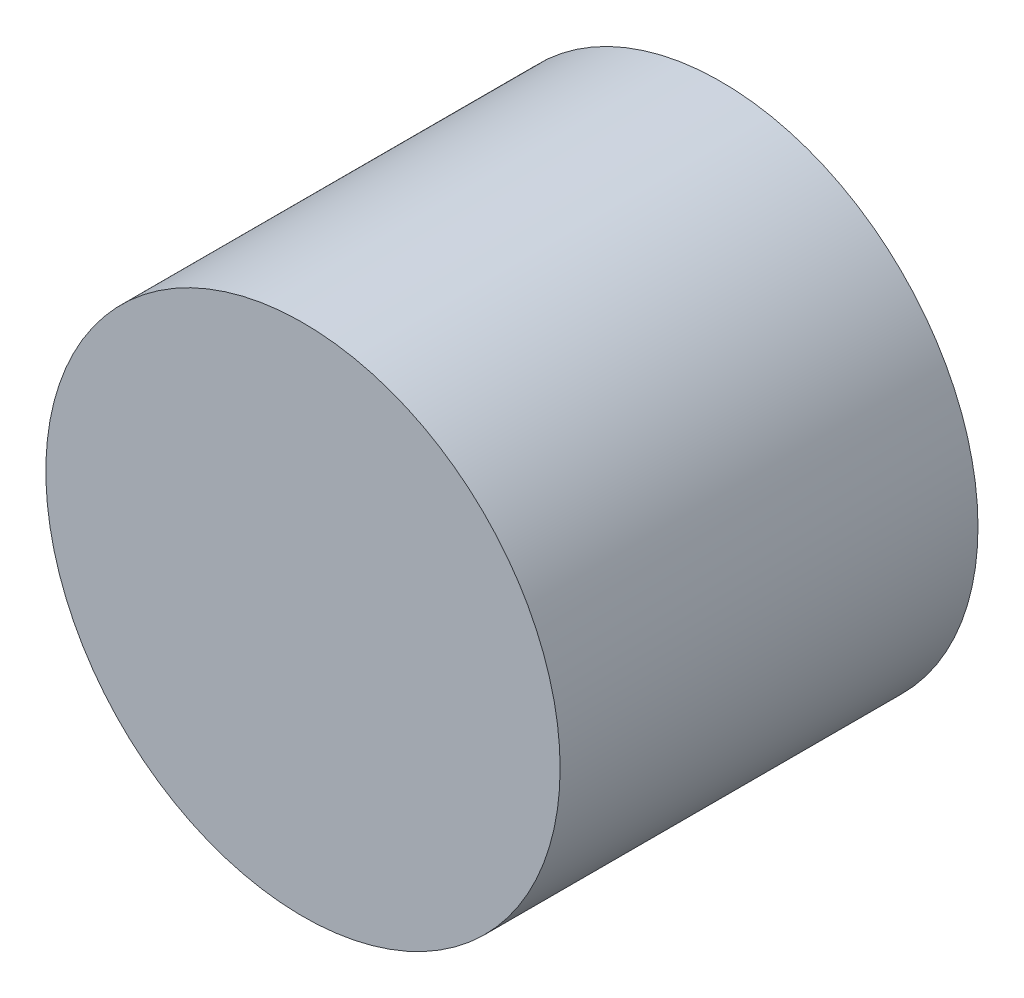
ISO-10303-21;
HEADER;
FILE_DESCRIPTION(('STEP AP214'),'2;1');
FILE_NAME('part.step','',(''),(''),'','','');
FILE_SCHEMA(('AUTOMOTIVE_DESIGN { 1 0 10303 214 1 1 1 1 }'));
ENDSEC;
DATA;
#1=APPLICATION_CONTEXT('core data for automotive mechanical design processes');
#2=APPLICATION_PROTOCOL_DEFINITION('international standard','automotive_design',2000,#1);
#3=PRODUCT_CONTEXT('',#1,'mechanical');
#4=PRODUCT('Part','Part','',(#3));
#5=PRODUCT_RELATED_PRODUCT_CATEGORY('part','',(#4));
#6=PRODUCT_DEFINITION_FORMATION('','',#4);
#7=PRODUCT_DEFINITION_CONTEXT('part definition',#1,'design');
#8=PRODUCT_DEFINITION('design','',#6,#7);
#9=PRODUCT_DEFINITION_SHAPE('','',#8);
#10=(LENGTH_UNIT() NAMED_UNIT(*) SI_UNIT(.MILLI.,.METRE.));
#11=(NAMED_UNIT(*) PLANE_ANGLE_UNIT() SI_UNIT($,.RADIAN.));
#12=(NAMED_UNIT(*) SI_UNIT($,.STERADIAN.) SOLID_ANGLE_UNIT());
#13=UNCERTAINTY_MEASURE_WITH_UNIT(LENGTH_MEASURE(1.E-05),#10,'distance_accuracy_value','');
#14=(GEOMETRIC_REPRESENTATION_CONTEXT(3) GLOBAL_UNCERTAINTY_ASSIGNED_CONTEXT((#13)) GLOBAL_UNIT_ASSIGNED_CONTEXT((#10,
#11,#12)) REPRESENTATION_CONTEXT('',''));
#15=CARTESIAN_POINT('',(0.,0.,0.));
#16=DIRECTION('',(0.,0.,1.));
#17=DIRECTION('',(1.,0.,0.));
#18=AXIS2_PLACEMENT_3D('',#15,#16,#17);
#19=CARTESIAN_POINT('',(0.,0.,16.51));
#20=DIRECTION('',(0.,0.,-1.));
#21=DIRECTION('',(-1.,0.,0.));
#22=AXIS2_PLACEMENT_3D('',#19,#20,#21);
#23=CYLINDRICAL_SURFACE('',#22,10.16);
#24=CARTESIAN_POINT('',(0.,0.,16.51));
#25=DIRECTION('',(0.,0.,1.));
#26=DIRECTION('',(1.,0.,0.));
#27=AXIS2_PLACEMENT_3D('',#24,#25,#26);
#28=CIRCLE('',#27,10.16);
#29=CARTESIAN_POINT('',(10.16,0.,16.51));
#30=VERTEX_POINT('',#29);
#31=EDGE_CURVE('E10',#30,#30,#28,.T.);
#32=ORIENTED_EDGE('',*,*,#31,.F.);
#33=EDGE_LOOP('',(#32));
#34=FACE_BOUND('',#33,.T.);
#35=CARTESIAN_POINT('',(0.,0.,0.));
#36=DIRECTION('',(0.,0.,1.));
#37=DIRECTION('',(1.,0.,0.));
#38=AXIS2_PLACEMENT_3D('',#35,#36,#37);
#39=CIRCLE('',#38,10.16);
#40=CARTESIAN_POINT('',(10.16,0.,0.));
#41=VERTEX_POINT('',#40);
#42=EDGE_CURVE('E33',#41,#41,#39,.T.);
#43=ORIENTED_EDGE('',*,*,#42,.T.);
#44=EDGE_LOOP('',(#43));
#45=FACE_BOUND('',#44,.T.);
#46=ADVANCED_FACE('F30',(#34,#45),#23,.T.);
#47=CARTESIAN_POINT('',(0.,0.,16.51));
#48=DIRECTION('',(0.,0.,1.));
#49=DIRECTION('',(1.,0.,0.));
#50=AXIS2_PLACEMENT_3D('',#47,#48,#49);
#51=PLANE('',#50);
#52=ORIENTED_EDGE('',*,*,#31,.T.);
#53=EDGE_LOOP('',(#52));
#54=FACE_BOUND('',#53,.T.);
#55=ADVANCED_FACE('F45',(#54),#51,.T.);
#56=CARTESIAN_POINT('',(0.,0.,0.));
#57=DIRECTION('',(0.,0.,1.));
#58=DIRECTION('',(1.,0.,0.));
#59=AXIS2_PLACEMENT_3D('',#56,#57,#58);
#60=PLANE('',#59);
#61=ORIENTED_EDGE('',*,*,#42,.F.);
#62=EDGE_LOOP('',(#61));
#63=FACE_BOUND('',#62,.T.);
#64=ADVANCED_FACE('F43',(#63),#60,.F.);
#65=CLOSED_SHELL('',(#46,#55,#64));
#66=MANIFOLD_SOLID_BREP('B2',#65);
#67=ADVANCED_BREP_SHAPE_REPRESENTATION('',(#18,#66),#14);
#68=SHAPE_DEFINITION_REPRESENTATION(#9,#67);
ENDSEC;
END-ISO-10303-21;
